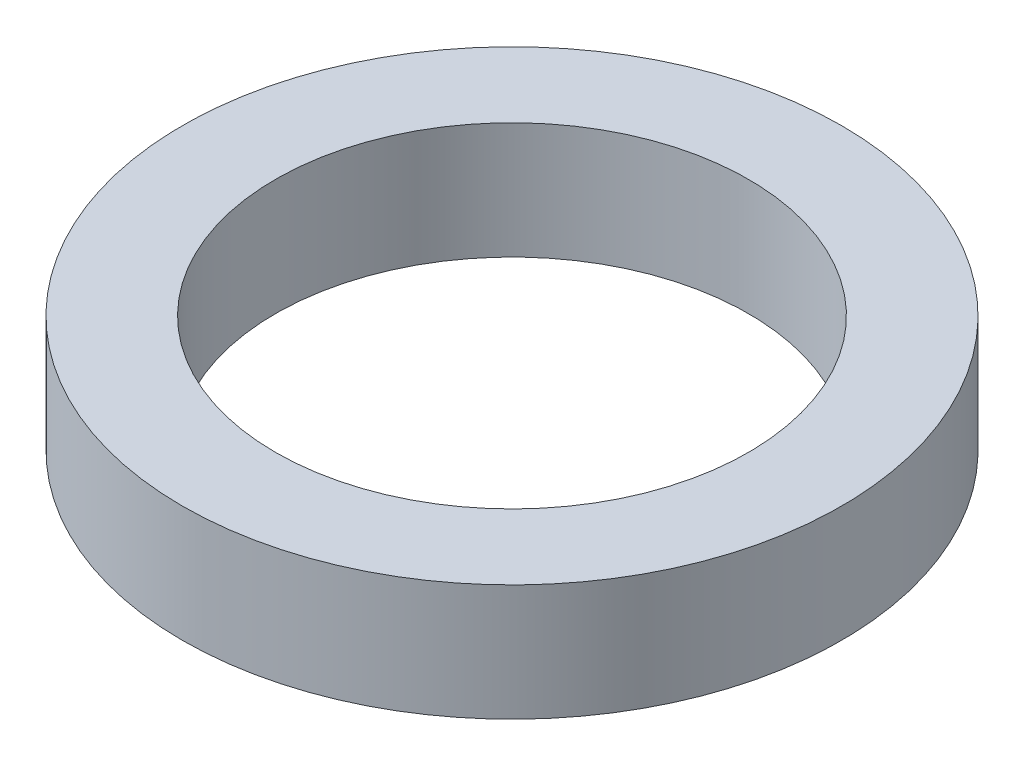
ISO-10303-21;
HEADER;
FILE_DESCRIPTION(('STEP AP214'),'2;1');
FILE_NAME('part.step','',(''),(''),'','','');
FILE_SCHEMA(('AUTOMOTIVE_DESIGN { 1 0 10303 214 1 1 1 1 }'));
ENDSEC;
DATA;
#1=APPLICATION_CONTEXT('core data for automotive mechanical design processes');
#2=APPLICATION_PROTOCOL_DEFINITION('international standard','automotive_design',2000,#1);
#3=PRODUCT_CONTEXT('',#1,'mechanical');
#4=PRODUCT('Part','Part','',(#3));
#5=PRODUCT_RELATED_PRODUCT_CATEGORY('part','',(#4));
#6=PRODUCT_DEFINITION_FORMATION('','',#4);
#7=PRODUCT_DEFINITION_CONTEXT('part definition',#1,'design');
#8=PRODUCT_DEFINITION('design','',#6,#7);
#9=PRODUCT_DEFINITION_SHAPE('','',#8);
#10=(LENGTH_UNIT() NAMED_UNIT(*) SI_UNIT(.MILLI.,.METRE.));
#11=(NAMED_UNIT(*) PLANE_ANGLE_UNIT() SI_UNIT($,.RADIAN.));
#12=(NAMED_UNIT(*) SI_UNIT($,.STERADIAN.) SOLID_ANGLE_UNIT());
#13=UNCERTAINTY_MEASURE_WITH_UNIT(LENGTH_MEASURE(1.E-05),#10,'distance_accuracy_value','');
#14=(GEOMETRIC_REPRESENTATION_CONTEXT(3) GLOBAL_UNCERTAINTY_ASSIGNED_CONTEXT((#13)) GLOBAL_UNIT_ASSIGNED_CONTEXT((#10,
#11,#12)) REPRESENTATION_CONTEXT('',''));
#15=CARTESIAN_POINT('',(0.,0.,0.));
#16=DIRECTION('',(0.,0.,1.));
#17=DIRECTION('',(1.,0.,0.));
#18=AXIS2_PLACEMENT_3D('',#15,#16,#17);
#19=CARTESIAN_POINT('',(-56.2916512459885,-133.,0.));
#20=DIRECTION('',(0.,1.,0.));
#21=DIRECTION('',(0.,0.,1.));
#22=AXIS2_PLACEMENT_3D('',#19,#20,#21);
#23=PLANE('',#22);
#24=CARTESIAN_POINT('',(-56.2916512459885,-133.,0.));
#25=DIRECTION('',(0.,1.,0.));
#26=DIRECTION('',(0.,0.,1.));
#27=AXIS2_PLACEMENT_3D('',#24,#25,#26);
#28=CIRCLE('',#27,8.5);
#29=CARTESIAN_POINT('',(-56.2916512459885,-133.,8.5));
#30=VERTEX_POINT('',#29);
#31=EDGE_CURVE('E10',#30,#30,#28,.T.);
#32=ORIENTED_EDGE('',*,*,#31,.T.);
#33=EDGE_LOOP('',(#32));
#34=FACE_BOUND('',#33,.T.);
#35=CARTESIAN_POINT('',(-56.2916512459885,-133.,0.));
#36=DIRECTION('',(0.,1.,0.));
#37=DIRECTION('',(0.,0.,1.));
#38=AXIS2_PLACEMENT_3D('',#35,#36,#37);
#39=CIRCLE('',#38,6.1);
#40=CARTESIAN_POINT('',(-56.2916512459885,-133.,6.1));
#41=VERTEX_POINT('',#40);
#42=EDGE_CURVE('E49',#41,#41,#39,.T.);
#43=ORIENTED_EDGE('',*,*,#42,.F.);
#44=EDGE_LOOP('',(#43));
#45=FACE_BOUND('',#44,.T.);
#46=ADVANCED_FACE('F39',(#34,#45),#23,.T.);
#47=CARTESIAN_POINT('',(-56.2916512459885,-136.,0.));
#48=DIRECTION('',(0.,1.,0.));
#49=DIRECTION('',(0.,0.,1.));
#50=AXIS2_PLACEMENT_3D('',#47,#48,#49);
#51=PLANE('',#50);
#52=CARTESIAN_POINT('',(-56.2916512459885,-136.,0.));
#53=DIRECTION('',(0.,1.,0.));
#54=DIRECTION('',(0.,0.,1.));
#55=AXIS2_PLACEMENT_3D('',#52,#53,#54);
#56=CIRCLE('',#55,8.5);
#57=CARTESIAN_POINT('',(-56.2916512459885,-136.,8.5));
#58=VERTEX_POINT('',#57);
#59=EDGE_CURVE('E43',#58,#58,#56,.T.);
#60=ORIENTED_EDGE('',*,*,#59,.F.);
#61=EDGE_LOOP('',(#60));
#62=FACE_BOUND('',#61,.T.);
#63=CARTESIAN_POINT('',(-56.2916512459885,-136.,0.));
#64=DIRECTION('',(0.,1.,0.));
#65=DIRECTION('',(0.,0.,1.));
#66=AXIS2_PLACEMENT_3D('',#63,#64,#65);
#67=CIRCLE('',#66,6.1);
#68=CARTESIAN_POINT('',(-56.2916512459885,-136.,6.1));
#69=VERTEX_POINT('',#68);
#70=EDGE_CURVE('E55',#69,#69,#67,.T.);
#71=ORIENTED_EDGE('',*,*,#70,.T.);
#72=EDGE_LOOP('',(#71));
#73=FACE_BOUND('',#72,.T.);
#74=ADVANCED_FACE('F61',(#62,#73),#51,.F.);
#75=CARTESIAN_POINT('',(-56.2916512459885,-133.,0.));
#76=DIRECTION('',(0.,-1.,0.));
#77=DIRECTION('',(0.,0.,-1.));
#78=AXIS2_PLACEMENT_3D('',#75,#76,#77);
#79=CYLINDRICAL_SURFACE('',#78,8.5);
#80=ORIENTED_EDGE('',*,*,#31,.F.);
#81=EDGE_LOOP('',(#80));
#82=FACE_BOUND('',#81,.T.);
#83=ORIENTED_EDGE('',*,*,#59,.T.);
#84=EDGE_LOOP('',(#83));
#85=FACE_BOUND('',#84,.T.);
#86=ADVANCED_FACE('F41',(#82,#85),#79,.T.);
#87=CARTESIAN_POINT('',(-56.2916512459885,-133.,0.));
#88=DIRECTION('',(0.,-1.,0.));
#89=DIRECTION('',(0.,0.,-1.));
#90=AXIS2_PLACEMENT_3D('',#87,#88,#89);
#91=CYLINDRICAL_SURFACE('',#90,6.1);
#92=ORIENTED_EDGE('',*,*,#42,.T.);
#93=EDGE_LOOP('',(#92));
#94=FACE_BOUND('',#93,.T.);
#95=ORIENTED_EDGE('',*,*,#70,.F.);
#96=EDGE_LOOP('',(#95));
#97=FACE_BOUND('',#96,.T.);
#98=ADVANCED_FACE('F59',(#94,#97),#91,.F.);
#99=CLOSED_SHELL('',(#46,#74,#86,#98));
#100=MANIFOLD_SOLID_BREP('B2',#99);
#101=ADVANCED_BREP_SHAPE_REPRESENTATION('',(#18,#100),#14);
#102=SHAPE_DEFINITION_REPRESENTATION(#9,#101);
ENDSEC;
END-ISO-10303-21;
